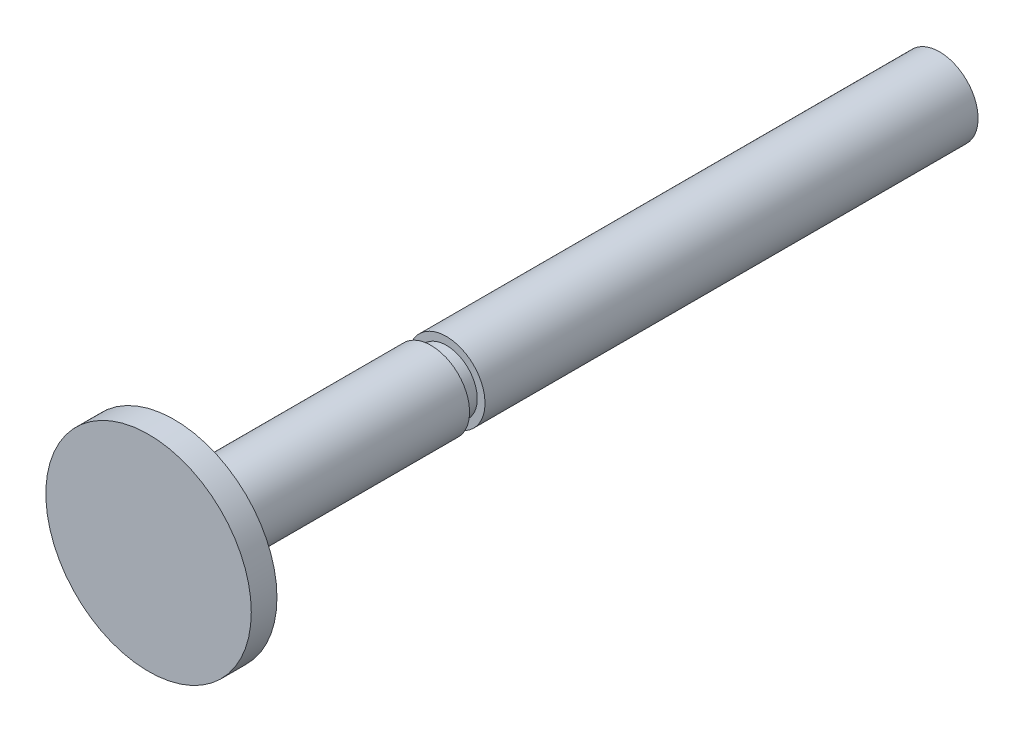
ISO-10303-21;
HEADER;
FILE_DESCRIPTION(('STEP AP214'),'2;1');
FILE_NAME('part.step','',(''),(''),'','','');
FILE_SCHEMA(('AUTOMOTIVE_DESIGN { 1 0 10303 214 1 1 1 1 }'));
ENDSEC;
DATA;
#1=APPLICATION_CONTEXT('core data for automotive mechanical design processes');
#2=APPLICATION_PROTOCOL_DEFINITION('international standard','automotive_design',2000,#1);
#3=PRODUCT_CONTEXT('',#1,'mechanical');
#4=PRODUCT('Part','Part','',(#3));
#5=PRODUCT_RELATED_PRODUCT_CATEGORY('part','',(#4));
#6=PRODUCT_DEFINITION_FORMATION('','',#4);
#7=PRODUCT_DEFINITION_CONTEXT('part definition',#1,'design');
#8=PRODUCT_DEFINITION('design','',#6,#7);
#9=PRODUCT_DEFINITION_SHAPE('','',#8);
#10=(LENGTH_UNIT() NAMED_UNIT(*) SI_UNIT(.MILLI.,.METRE.));
#11=(NAMED_UNIT(*) PLANE_ANGLE_UNIT() SI_UNIT($,.RADIAN.));
#12=(NAMED_UNIT(*) SI_UNIT($,.STERADIAN.) SOLID_ANGLE_UNIT());
#13=UNCERTAINTY_MEASURE_WITH_UNIT(LENGTH_MEASURE(1.E-05),#10,'distance_accuracy_value','');
#14=(GEOMETRIC_REPRESENTATION_CONTEXT(3) GLOBAL_UNCERTAINTY_ASSIGNED_CONTEXT((#13)) GLOBAL_UNIT_ASSIGNED_CONTEXT((#10,
#11,#12)) REPRESENTATION_CONTEXT('',''));
#15=CARTESIAN_POINT('',(0.,0.,0.));
#16=DIRECTION('',(0.,0.,1.));
#17=DIRECTION('',(1.,0.,0.));
#18=AXIS2_PLACEMENT_3D('',#15,#16,#17);
#19=CARTESIAN_POINT('',(0.,0.,0.5));
#20=DIRECTION('',(0.,0.,-1.));
#21=DIRECTION('',(-1.,0.,0.));
#22=AXIS2_PLACEMENT_3D('',#19,#20,#21);
#23=CYLINDRICAL_SURFACE('',#22,2.);
#24=CARTESIAN_POINT('',(0.,0.,0.5));
#25=DIRECTION('',(0.,0.,1.));
#26=DIRECTION('',(1.,0.,0.));
#27=AXIS2_PLACEMENT_3D('',#24,#25,#26);
#28=CIRCLE('',#27,2.);
#29=CARTESIAN_POINT('',(2.,0.,0.5));
#30=VERTEX_POINT('',#29);
#31=EDGE_CURVE('E51',#30,#30,#28,.T.);
#32=ORIENTED_EDGE('',*,*,#31,.F.);
#33=EDGE_LOOP('',(#32));
#34=FACE_BOUND('',#33,.T.);
#35=CARTESIAN_POINT('',(0.,0.,0.));
#36=DIRECTION('',(0.,0.,1.));
#37=DIRECTION('',(1.,0.,0.));
#38=AXIS2_PLACEMENT_3D('',#35,#36,#37);
#39=CIRCLE('',#38,2.);
#40=CARTESIAN_POINT('',(2.,0.,0.));
#41=VERTEX_POINT('',#40);
#42=EDGE_CURVE('E40',#41,#41,#39,.T.);
#43=ORIENTED_EDGE('',*,*,#42,.T.);
#44=EDGE_LOOP('',(#43));
#45=FACE_BOUND('',#44,.T.);
#46=ADVANCED_FACE('F37',(#34,#45),#23,.T.);
#47=CARTESIAN_POINT('',(0.,0.,0.5));
#48=DIRECTION('',(0.,0.,1.));
#49=DIRECTION('',(1.,0.,0.));
#50=AXIS2_PLACEMENT_3D('',#47,#48,#49);
#51=PLANE('',#50);
#52=ORIENTED_EDGE('',*,*,#31,.T.);
#53=EDGE_LOOP('',(#52));
#54=FACE_BOUND('',#53,.T.);
#55=ADVANCED_FACE('F72',(#54),#51,.T.);
#56=CARTESIAN_POINT('',(0.,0.,0.));
#57=DIRECTION('',(0.,0.,1.));
#58=DIRECTION('',(1.,0.,0.));
#59=AXIS2_PLACEMENT_3D('',#56,#57,#58);
#60=PLANE('',#59);
#61=CARTESIAN_POINT('',(0.,0.,0.));
#62=DIRECTION('',(0.,0.,-1.));
#63=DIRECTION('',(-1.,0.,0.));
#64=AXIS2_PLACEMENT_3D('',#61,#62,#63);
#65=CIRCLE('',#64,0.75);
#66=CARTESIAN_POINT('',(-0.75,0.,0.));
#67=VERTEX_POINT('',#66);
#68=EDGE_CURVE('E45',#67,#67,#65,.T.);
#69=ORIENTED_EDGE('',*,*,#68,.F.);
#70=EDGE_LOOP('',(#69));
#71=FACE_BOUND('',#70,.T.);
#72=ORIENTED_EDGE('',*,*,#42,.F.);
#73=EDGE_LOOP('',(#72));
#74=FACE_BOUND('',#73,.T.);
#75=ADVANCED_FACE('F69',(#71,#74),#60,.F.);
#76=CARTESIAN_POINT('',(0.,0.,-5.));
#77=DIRECTION('',(0.,0.,1.));
#78=DIRECTION('',(1.,0.,0.));
#79=AXIS2_PLACEMENT_3D('',#76,#77,#78);
#80=CYLINDRICAL_SURFACE('',#79,0.75);
#81=CARTESIAN_POINT('',(0.,0.,-5.));
#82=DIRECTION('',(0.,0.,-1.));
#83=DIRECTION('',(-1.,0.,0.));
#84=AXIS2_PLACEMENT_3D('',#81,#82,#83);
#85=CIRCLE('',#84,0.75);
#86=CARTESIAN_POINT('',(-0.75,0.,-5.));
#87=VERTEX_POINT('',#86);
#88=EDGE_CURVE('E57',#87,#87,#85,.T.);
#89=ORIENTED_EDGE('',*,*,#88,.F.);
#90=EDGE_LOOP('',(#89));
#91=FACE_BOUND('',#90,.T.);
#92=ORIENTED_EDGE('',*,*,#68,.T.);
#93=EDGE_LOOP('',(#92));
#94=FACE_BOUND('',#93,.T.);
#95=ADVANCED_FACE('F71',(#91,#94),#80,.T.);
#96=CARTESIAN_POINT('',(0.,0.,-5.));
#97=DIRECTION('',(0.,0.,-1.));
#98=DIRECTION('',(-1.,0.,0.));
#99=AXIS2_PLACEMENT_3D('',#96,#97,#98);
#100=PLANE('',#99);
#101=CARTESIAN_POINT('',(0.,0.,-5.));
#102=DIRECTION('',(0.,0.,-1.));
#103=DIRECTION('',(-1.,0.,0.));
#104=AXIS2_PLACEMENT_3D('',#101,#102,#103);
#105=CIRCLE('',#104,0.6);
#106=CARTESIAN_POINT('',(-0.6,0.,-5.));
#107=VERTEX_POINT('',#106);
#108=EDGE_CURVE('E10',#107,#107,#105,.T.);
#109=ORIENTED_EDGE('',*,*,#108,.F.);
#110=EDGE_LOOP('',(#109));
#111=FACE_BOUND('',#110,.T.);
#112=ORIENTED_EDGE('',*,*,#88,.T.);
#113=EDGE_LOOP('',(#112));
#114=FACE_BOUND('',#113,.T.);
#115=ADVANCED_FACE('F78',(#111,#114),#100,.T.);
#116=CARTESIAN_POINT('',(0.,0.,-5.3));
#117=DIRECTION('',(0.,0.,1.));
#118=DIRECTION('',(1.,0.,0.));
#119=AXIS2_PLACEMENT_3D('',#116,#117,#118);
#120=CYLINDRICAL_SURFACE('',#119,0.6);
#121=CARTESIAN_POINT('',(0.,0.,-5.3));
#122=DIRECTION('',(0.,0.,-1.));
#123=DIRECTION('',(-1.,0.,0.));
#124=AXIS2_PLACEMENT_3D('',#121,#122,#123);
#125=CIRCLE('',#124,0.6);
#126=CARTESIAN_POINT('',(-0.6,0.,-5.3));
#127=VERTEX_POINT('',#126);
#128=EDGE_CURVE('E55',#127,#127,#125,.T.);
#129=ORIENTED_EDGE('',*,*,#128,.F.);
#130=EDGE_LOOP('',(#129));
#131=FACE_BOUND('',#130,.T.);
#132=ORIENTED_EDGE('',*,*,#108,.T.);
#133=EDGE_LOOP('',(#132));
#134=FACE_BOUND('',#133,.T.);
#135=ADVANCED_FACE('F110',(#131,#134),#120,.T.);
#136=CARTESIAN_POINT('',(0.,0.,-14.9));
#137=DIRECTION('',(0.,0.,1.));
#138=DIRECTION('',(1.,0.,0.));
#139=AXIS2_PLACEMENT_3D('',#136,#137,#138);
#140=CYLINDRICAL_SURFACE('',#139,0.75);
#141=CARTESIAN_POINT('',(0.,0.,-14.9));
#142=DIRECTION('',(0.,0.,-1.));
#143=DIRECTION('',(-1.,0.,0.));
#144=AXIS2_PLACEMENT_3D('',#141,#142,#143);
#145=CIRCLE('',#144,0.75);
#146=CARTESIAN_POINT('',(-0.75,0.,-14.9));
#147=VERTEX_POINT('',#146);
#148=EDGE_CURVE('E162',#147,#147,#145,.T.);
#149=ORIENTED_EDGE('',*,*,#148,.F.);
#150=EDGE_LOOP('',(#149));
#151=FACE_BOUND('',#150,.T.);
#152=CARTESIAN_POINT('',(0.,0.,-5.3));
#153=DIRECTION('',(0.,0.,-1.));
#154=DIRECTION('',(-1.,0.,0.));
#155=AXIS2_PLACEMENT_3D('',#152,#153,#154);
#156=CIRCLE('',#155,0.75);
#157=CARTESIAN_POINT('',(-0.75,0.,-5.3));
#158=VERTEX_POINT('',#157);
#159=EDGE_CURVE('E159',#158,#158,#156,.T.);
#160=ORIENTED_EDGE('',*,*,#159,.T.);
#161=EDGE_LOOP('',(#160));
#162=FACE_BOUND('',#161,.T.);
#163=ADVANCED_FACE('F120',(#151,#162),#140,.T.);
#164=CARTESIAN_POINT('',(0.,0.,-14.9));
#165=DIRECTION('',(0.,0.,-1.));
#166=DIRECTION('',(-1.,0.,0.));
#167=AXIS2_PLACEMENT_3D('',#164,#165,#166);
#168=PLANE('',#167);
#169=ORIENTED_EDGE('',*,*,#148,.T.);
#170=EDGE_LOOP('',(#169));
#171=FACE_BOUND('',#170,.T.);
#172=ADVANCED_FACE('F130',(#171),#168,.T.);
#173=CARTESIAN_POINT('',(0.,0.,-5.3));
#174=DIRECTION('',(0.,0.,-1.));
#175=DIRECTION('',(-1.,0.,0.));
#176=AXIS2_PLACEMENT_3D('',#173,#174,#175);
#177=PLANE('',#176);
#178=ORIENTED_EDGE('',*,*,#128,.T.);
#179=EDGE_LOOP('',(#178));
#180=FACE_BOUND('',#179,.T.);
#181=ORIENTED_EDGE('',*,*,#159,.F.);
#182=EDGE_LOOP('',(#181));
#183=FACE_BOUND('',#182,.T.);
#184=ADVANCED_FACE('F140',(#180,#183),#177,.F.);
#185=CLOSED_SHELL('',(#46,#55,#75,#95,#115,#135,#163,#172,#184));
#186=MANIFOLD_SOLID_BREP('B2',#185);
#187=ADVANCED_BREP_SHAPE_REPRESENTATION('',(#18,#186),#14);
#188=SHAPE_DEFINITION_REPRESENTATION(#9,#187);
ENDSEC;
END-ISO-10303-21;
